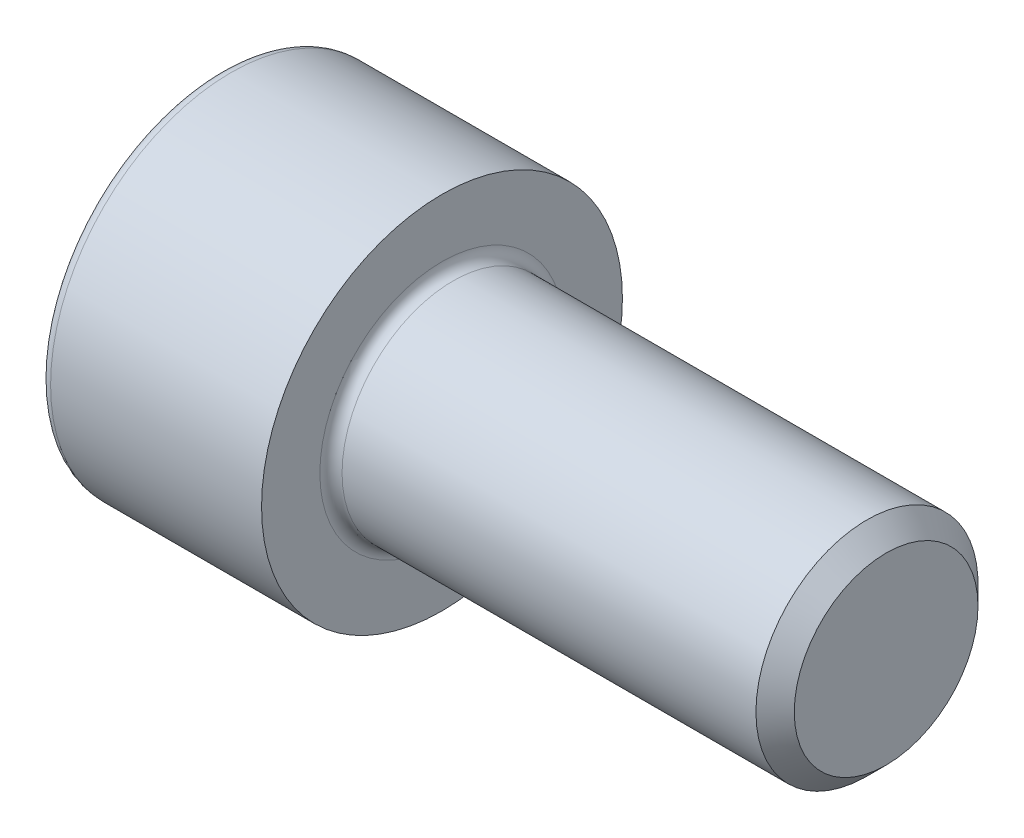
ISO-10303-21;
HEADER;
FILE_DESCRIPTION(('STEP AP214'),'2;1');
FILE_NAME('part.step','',(''),(''),'','','');
FILE_SCHEMA(('AUTOMOTIVE_DESIGN { 1 0 10303 214 1 1 1 1 }'));
ENDSEC;
DATA;
#1=APPLICATION_CONTEXT('core data for automotive mechanical design processes');
#2=APPLICATION_PROTOCOL_DEFINITION('international standard','automotive_design',2000,#1);
#3=PRODUCT_CONTEXT('',#1,'mechanical');
#4=PRODUCT('Part','Part','',(#3));
#5=PRODUCT_RELATED_PRODUCT_CATEGORY('part','',(#4));
#6=PRODUCT_DEFINITION_FORMATION('','',#4);
#7=PRODUCT_DEFINITION_CONTEXT('part definition',#1,'design');
#8=PRODUCT_DEFINITION('design','',#6,#7);
#9=PRODUCT_DEFINITION_SHAPE('','',#8);
#10=(LENGTH_UNIT() NAMED_UNIT(*) SI_UNIT(.MILLI.,.METRE.));
#11=(NAMED_UNIT(*) PLANE_ANGLE_UNIT() SI_UNIT($,.RADIAN.));
#12=(NAMED_UNIT(*) SI_UNIT($,.STERADIAN.) SOLID_ANGLE_UNIT());
#13=UNCERTAINTY_MEASURE_WITH_UNIT(LENGTH_MEASURE(1.E-05),#10,'distance_accuracy_value','');
#14=(GEOMETRIC_REPRESENTATION_CONTEXT(3) GLOBAL_UNCERTAINTY_ASSIGNED_CONTEXT((#13)) GLOBAL_UNIT_ASSIGNED_CONTEXT((#10,
#11,#12)) REPRESENTATION_CONTEXT('',''));
#15=CARTESIAN_POINT('',(0.,0.,0.));
#16=DIRECTION('',(0.,0.,1.));
#17=DIRECTION('',(1.,0.,0.));
#18=AXIS2_PLACEMENT_3D('',#15,#16,#17);
#19=CARTESIAN_POINT('',(0.,0.,0.));
#20=DIRECTION('',(-1.,0.,0.));
#21=DIRECTION('',(0.,0.,1.));
#22=AXIS2_PLACEMENT_3D('',#19,#20,#21);
#23=PLANE('',#22);
#24=DIRECTION('',(0.,-0.5,0.866025403784439));
#25=VECTOR('',#24,1.);
#26=CARTESIAN_POINT('',(0.,3.51894989071077,0.));
#27=LINE('',#26,#25);
#28=CARTESIAN_POINT('',(0.,3.51894989071077,0.));
#29=VERTEX_POINT('',#28);
#30=CARTESIAN_POINT('',(0.,1.75947494535539,3.0475));
#31=VERTEX_POINT('',#30);
#32=EDGE_CURVE('E262',#29,#31,#27,.T.);
#33=ORIENTED_EDGE('',*,*,#32,.T.);
#34=DIRECTION('',(0.,1.,0.));
#35=VECTOR('',#34,1.);
#36=CARTESIAN_POINT('',(0.,-1.75947494535538,3.0475));
#37=LINE('',#36,#35);
#38=CARTESIAN_POINT('',(0.,-1.75947494535538,3.0475));
#39=VERTEX_POINT('',#38);
#40=EDGE_CURVE('E134',#39,#31,#37,.T.);
#41=ORIENTED_EDGE('',*,*,#40,.F.);
#42=DIRECTION('',(0.,-0.500000000000001,-0.866025403784438));
#43=VECTOR('',#42,1.);
#44=CARTESIAN_POINT('',(0.,-1.75947494535538,3.0475));
#45=LINE('',#44,#43);
#46=CARTESIAN_POINT('',(0.,-3.51894989071077,0.));
#47=VERTEX_POINT('',#46);
#48=EDGE_CURVE('E265',#39,#47,#45,.T.);
#49=ORIENTED_EDGE('',*,*,#48,.T.);
#50=DIRECTION('',(0.,0.5,-0.866025403784439));
#51=VECTOR('',#50,1.);
#52=CARTESIAN_POINT('',(0.,-3.51894989071077,0.));
#53=LINE('',#52,#51);
#54=CARTESIAN_POINT('',(0.,-1.75947494535539,-3.0475));
#55=VERTEX_POINT('',#54);
#56=EDGE_CURVE('E268',#47,#55,#53,.T.);
#57=ORIENTED_EDGE('',*,*,#56,.T.);
#58=DIRECTION('',(0.,-1.,0.));
#59=VECTOR('',#58,1.);
#60=CARTESIAN_POINT('',(0.,1.75947494535538,-3.0475));
#61=LINE('',#60,#59);
#62=CARTESIAN_POINT('',(0.,1.75947494535538,-3.0475));
#63=VERTEX_POINT('',#62);
#64=EDGE_CURVE('E271',#63,#55,#61,.T.);
#65=ORIENTED_EDGE('',*,*,#64,.F.);
#66=DIRECTION('',(0.,-0.500000000000001,-0.866025403784438));
#67=VECTOR('',#66,1.);
#68=CARTESIAN_POINT('',(0.,3.51894989071077,0.));
#69=LINE('',#68,#67);
#70=EDGE_CURVE('E129',#29,#63,#69,.T.);
#71=ORIENTED_EDGE('',*,*,#70,.F.);
#72=EDGE_LOOP('',(#33,#41,#49,#57,#65,#71));
#73=FACE_BOUND('',#72,.T.);
#74=CARTESIAN_POINT('',(0.,0.,0.));
#75=DIRECTION('',(-1.,0.,0.));
#76=DIRECTION('',(0.,0.,1.));
#77=AXIS2_PLACEMENT_3D('',#74,#75,#76);
#78=CIRCLE('',#77,6.1);
#79=CARTESIAN_POINT('',(0.,0.,6.1));
#80=VERTEX_POINT('',#79);
#81=EDGE_CURVE('E46',#80,#80,#78,.T.);
#82=ORIENTED_EDGE('',*,*,#81,.T.);
#83=EDGE_LOOP('',(#82));
#84=FACE_BOUND('',#83,.T.);
#85=ADVANCED_FACE('F38',(#73,#84),#23,.T.);
#86=CARTESIAN_POINT('',(-31.75,0.,0.));
#87=DIRECTION('',(-1.,0.,0.));
#88=DIRECTION('',(0.,0.,1.));
#89=AXIS2_PLACEMENT_3D('',#86,#87,#88);
#90=CYLINDRICAL_SURFACE('',#89,6.5);
#91=CARTESIAN_POINT('',(0.399999999999998,0.,0.));
#92=DIRECTION('',(-1.,0.,0.));
#93=DIRECTION('',(0.,0.,1.));
#94=AXIS2_PLACEMENT_3D('',#91,#92,#93);
#95=CIRCLE('',#94,6.5);
#96=CARTESIAN_POINT('',(0.399999999999998,0.,6.5));
#97=VERTEX_POINT('',#96);
#98=EDGE_CURVE('E11',#97,#97,#95,.F.);
#99=ORIENTED_EDGE('',*,*,#98,.T.);
#100=EDGE_LOOP('',(#99));
#101=FACE_BOUND('',#100,.T.);
#102=CARTESIAN_POINT('',(8.,0.,0.));
#103=DIRECTION('',(-1.,0.,0.));
#104=DIRECTION('',(0.,0.,1.));
#105=AXIS2_PLACEMENT_3D('',#102,#103,#104);
#106=CIRCLE('',#105,6.5);
#107=CARTESIAN_POINT('',(8.,0.,6.5));
#108=VERTEX_POINT('',#107);
#109=EDGE_CURVE('E152',#108,#108,#106,.T.);
#110=ORIENTED_EDGE('',*,*,#109,.T.);
#111=EDGE_LOOP('',(#110));
#112=FACE_BOUND('',#111,.T.);
#113=ADVANCED_FACE('F176',(#101,#112),#90,.T.);
#114=CARTESIAN_POINT('',(8.,6.5,0.));
#115=DIRECTION('',(1.,0.,0.));
#116=DIRECTION('',(0.,0.,-1.));
#117=AXIS2_PLACEMENT_3D('',#114,#115,#116);
#118=PLANE('',#117);
#119=CARTESIAN_POINT('',(8.,0.,0.));
#120=DIRECTION('',(1.,0.,0.));
#121=DIRECTION('',(0.,0.,-1.));
#122=AXIS2_PLACEMENT_3D('',#119,#120,#121);
#123=CIRCLE('',#122,4.4);
#124=CARTESIAN_POINT('',(8.,0.,-4.4));
#125=VERTEX_POINT('',#124);
#126=EDGE_CURVE('E155',#125,#125,#123,.F.);
#127=ORIENTED_EDGE('',*,*,#126,.T.);
#128=EDGE_LOOP('',(#127));
#129=FACE_BOUND('',#128,.T.);
#130=ORIENTED_EDGE('',*,*,#109,.F.);
#131=EDGE_LOOP('',(#130));
#132=FACE_BOUND('',#131,.T.);
#133=ADVANCED_FACE('F182',(#129,#132),#118,.T.);
#134=CARTESIAN_POINT('',(-31.75,0.,0.));
#135=DIRECTION('',(-1.,0.,0.));
#136=DIRECTION('',(0.,0.,1.));
#137=AXIS2_PLACEMENT_3D('',#134,#135,#136);
#138=CYLINDRICAL_SURFACE('',#137,4.);
#139=CARTESIAN_POINT('',(8.4,0.,0.));
#140=DIRECTION('',(1.,0.,0.));
#141=DIRECTION('',(0.,0.,-1.));
#142=AXIS2_PLACEMENT_3D('',#139,#140,#141);
#143=CIRCLE('',#142,4.);
#144=CARTESIAN_POINT('',(8.4,0.,-4.));
#145=VERTEX_POINT('',#144);
#146=EDGE_CURVE('E158',#145,#145,#143,.T.);
#147=ORIENTED_EDGE('',*,*,#146,.T.);
#148=EDGE_LOOP('',(#147));
#149=FACE_BOUND('',#148,.T.);
#150=CARTESIAN_POINT('',(23.3095,0.,0.));
#151=DIRECTION('',(-1.,0.,0.));
#152=DIRECTION('',(0.,0.,1.));
#153=AXIS2_PLACEMENT_3D('',#150,#151,#152);
#154=CIRCLE('',#153,4.);
#155=CARTESIAN_POINT('',(23.3095,0.,4.));
#156=VERTEX_POINT('',#155);
#157=EDGE_CURVE('E149',#156,#156,#154,.T.);
#158=ORIENTED_EDGE('',*,*,#157,.T.);
#159=EDGE_LOOP('',(#158));
#160=FACE_BOUND('',#159,.T.);
#161=ADVANCED_FACE('F188',(#149,#160),#138,.T.);
#162=CARTESIAN_POINT('',(24.,0.,0.));
#163=DIRECTION('',(-1.,0.,0.));
#164=DIRECTION('',(0.,0.,1.));
#165=AXIS2_PLACEMENT_3D('',#162,#163,#164);
#166=CONICAL_SURFACE('',#165,3.3095,0.785398163397466);
#167=ORIENTED_EDGE('',*,*,#157,.F.);
#168=EDGE_LOOP('',(#167));
#169=FACE_BOUND('',#168,.T.);
#170=CARTESIAN_POINT('',(24.,0.,0.));
#171=DIRECTION('',(-1.,0.,0.));
#172=DIRECTION('',(0.,0.,1.));
#173=AXIS2_PLACEMENT_3D('',#170,#171,#172);
#174=CIRCLE('',#173,3.3095);
#175=CARTESIAN_POINT('',(24.,0.,3.3095));
#176=VERTEX_POINT('',#175);
#177=EDGE_CURVE('E145',#176,#176,#174,.T.);
#178=ORIENTED_EDGE('',*,*,#177,.T.);
#179=EDGE_LOOP('',(#178));
#180=FACE_BOUND('',#179,.T.);
#181=ADVANCED_FACE('F192',(#169,#180),#166,.T.);
#182=CARTESIAN_POINT('',(24.,3.3095,0.));
#183=DIRECTION('',(1.,0.,0.));
#184=DIRECTION('',(0.,0.,-1.));
#185=AXIS2_PLACEMENT_3D('',#182,#183,#184);
#186=PLANE('',#185);
#187=ORIENTED_EDGE('',*,*,#177,.F.);
#188=EDGE_LOOP('',(#187));
#189=FACE_BOUND('',#188,.T.);
#190=ADVANCED_FACE('F172',(#189),#186,.T.);
#191=CARTESIAN_POINT('',(8.4,0.,0.));
#192=DIRECTION('',(1.,0.,0.));
#193=DIRECTION('',(0.,0.,-1.));
#194=AXIS2_PLACEMENT_3D('',#191,#192,#193);
#195=TOROIDAL_SURFACE('',#194,4.4,0.4);
#196=ORIENTED_EDGE('',*,*,#146,.F.);
#197=EDGE_LOOP('',(#196));
#198=FACE_BOUND('',#197,.T.);
#199=ORIENTED_EDGE('',*,*,#126,.F.);
#200=EDGE_LOOP('',(#199));
#201=FACE_BOUND('',#200,.T.);
#202=ADVANCED_FACE('F165',(#198,#201),#195,.F.);
#203=CARTESIAN_POINT('',(0.399999999999998,0.,0.));
#204=DIRECTION('',(-1.,0.,0.));
#205=DIRECTION('',(0.,0.,1.));
#206=AXIS2_PLACEMENT_3D('',#203,#204,#205);
#207=TOROIDAL_SURFACE('',#206,6.1,0.4);
#208=ORIENTED_EDGE('',*,*,#98,.F.);
#209=EDGE_LOOP('',(#208));
#210=FACE_BOUND('',#209,.T.);
#211=ORIENTED_EDGE('',*,*,#81,.F.);
#212=EDGE_LOOP('',(#211));
#213=FACE_BOUND('',#212,.T.);
#214=ADVANCED_FACE('F40',(#210,#213),#207,.T.);
#215=CARTESIAN_POINT('',(4.,3.51894989071077,0.));
#216=DIRECTION('',(0.,-0.866025403784439,-0.5));
#217=DIRECTION('',(0.,0.5,-0.866025403784439));
#218=AXIS2_PLACEMENT_3D('',#215,#216,#217);
#219=PLANE('',#218);
#220=ORIENTED_EDGE('',*,*,#32,.F.);
#221=DIRECTION('',(-1.,0.,0.));
#222=VECTOR('',#221,1.);
#223=CARTESIAN_POINT('',(4.,3.51894989071077,0.));
#224=LINE('',#223,#222);
#225=CARTESIAN_POINT('',(4.,3.51894989071077,0.));
#226=VERTEX_POINT('',#225);
#227=EDGE_CURVE('E252',#226,#29,#224,.T.);
#228=ORIENTED_EDGE('',*,*,#227,.F.);
#229=DIRECTION('',(0.,-0.5,0.866025403784439));
#230=VECTOR('',#229,1.);
#231=CARTESIAN_POINT('',(4.,3.51894989071077,0.));
#232=LINE('',#231,#230);
#233=CARTESIAN_POINT('',(4.,2.63921241803308,1.52375));
#234=VERTEX_POINT('',#233);
#235=EDGE_CURVE('E121',#226,#234,#232,.T.);
#236=ORIENTED_EDGE('',*,*,#235,.T.);
#237=CARTESIAN_POINT('',(4.,1.75947494535539,3.0475));
#238=VERTEX_POINT('',#237);
#239=EDGE_CURVE('E112',#234,#238,#232,.T.);
#240=ORIENTED_EDGE('',*,*,#239,.T.);
#241=DIRECTION('',(-1.,0.,0.));
#242=VECTOR('',#241,1.);
#243=CARTESIAN_POINT('',(4.,1.75947494535539,3.0475));
#244=LINE('',#243,#242);
#245=EDGE_CURVE('E126',#238,#31,#244,.T.);
#246=ORIENTED_EDGE('',*,*,#245,.T.);
#247=EDGE_LOOP('',(#220,#228,#236,#240,#246));
#248=FACE_BOUND('',#247,.T.);
#249=ADVANCED_FACE('F125',(#248),#219,.T.);
#250=CARTESIAN_POINT('',(4.,-1.75947494535538,3.0475));
#251=DIRECTION('',(0.,0.,1.));
#252=DIRECTION('',(0.,-1.,0.));
#253=AXIS2_PLACEMENT_3D('',#250,#251,#252);
#254=PLANE('',#253);
#255=ORIENTED_EDGE('',*,*,#40,.T.);
#256=ORIENTED_EDGE('',*,*,#245,.F.);
#257=DIRECTION('',(0.,1.,0.));
#258=VECTOR('',#257,1.);
#259=CARTESIAN_POINT('',(4.,-1.75947494535538,3.0475));
#260=LINE('',#259,#258);
#261=CARTESIAN_POINT('',(4.,0.,3.0475));
#262=VERTEX_POINT('',#261);
#263=EDGE_CURVE('E109',#262,#238,#260,.T.);
#264=ORIENTED_EDGE('',*,*,#263,.F.);
#265=CARTESIAN_POINT('',(4.,-1.75947494535538,3.0475));
#266=VERTEX_POINT('',#265);
#267=EDGE_CURVE('E120',#266,#262,#260,.T.);
#268=ORIENTED_EDGE('',*,*,#267,.F.);
#269=DIRECTION('',(-1.,0.,0.));
#270=VECTOR('',#269,1.);
#271=CARTESIAN_POINT('',(4.,-1.75947494535538,3.0475));
#272=LINE('',#271,#270);
#273=EDGE_CURVE('E136',#266,#39,#272,.T.);
#274=ORIENTED_EDGE('',*,*,#273,.T.);
#275=EDGE_LOOP('',(#255,#256,#264,#268,#274));
#276=FACE_BOUND('',#275,.T.);
#277=ADVANCED_FACE('F131',(#276),#254,.F.);
#278=CARTESIAN_POINT('',(4.,-1.75947494535538,3.0475));
#279=DIRECTION('',(0.,0.866025403784438,-0.500000000000001));
#280=DIRECTION('',(0.,0.500000000000001,0.866025403784438));
#281=AXIS2_PLACEMENT_3D('',#278,#279,#280);
#282=PLANE('',#281);
#283=ORIENTED_EDGE('',*,*,#48,.F.);
#284=ORIENTED_EDGE('',*,*,#273,.F.);
#285=DIRECTION('',(0.,-0.500000000000001,-0.866025403784438));
#286=VECTOR('',#285,1.);
#287=CARTESIAN_POINT('',(4.,-1.75947494535538,3.0475));
#288=LINE('',#287,#286);
#289=CARTESIAN_POINT('',(4.,-2.63921241803308,1.52375));
#290=VERTEX_POINT('',#289);
#291=EDGE_CURVE('E291',#266,#290,#288,.T.);
#292=ORIENTED_EDGE('',*,*,#291,.T.);
#293=CARTESIAN_POINT('',(4.,-3.51894989071077,0.));
#294=VERTEX_POINT('',#293);
#295=EDGE_CURVE('E280',#290,#294,#288,.T.);
#296=ORIENTED_EDGE('',*,*,#295,.T.);
#297=DIRECTION('',(-1.,0.,0.));
#298=VECTOR('',#297,1.);
#299=CARTESIAN_POINT('',(4.,-3.51894989071077,0.));
#300=LINE('',#299,#298);
#301=EDGE_CURVE('E141',#294,#47,#300,.T.);
#302=ORIENTED_EDGE('',*,*,#301,.T.);
#303=EDGE_LOOP('',(#283,#284,#292,#296,#302));
#304=FACE_BOUND('',#303,.T.);
#305=ADVANCED_FACE('F206',(#304),#282,.T.);
#306=CARTESIAN_POINT('',(4.,-3.51894989071077,0.));
#307=DIRECTION('',(0.,0.866025403784439,0.5));
#308=DIRECTION('',(0.,-0.5,0.866025403784439));
#309=AXIS2_PLACEMENT_3D('',#306,#307,#308);
#310=PLANE('',#309);
#311=ORIENTED_EDGE('',*,*,#56,.F.);
#312=ORIENTED_EDGE('',*,*,#301,.F.);
#313=DIRECTION('',(0.,0.5,-0.866025403784439));
#314=VECTOR('',#313,1.);
#315=CARTESIAN_POINT('',(4.,-3.51894989071077,0.));
#316=LINE('',#315,#314);
#317=CARTESIAN_POINT('',(4.,-2.63921241803308,-1.52375));
#318=VERTEX_POINT('',#317);
#319=EDGE_CURVE('E258',#294,#318,#316,.T.);
#320=ORIENTED_EDGE('',*,*,#319,.T.);
#321=CARTESIAN_POINT('',(4.,-1.75947494535539,-3.0475));
#322=VERTEX_POINT('',#321);
#323=EDGE_CURVE('E290',#318,#322,#316,.T.);
#324=ORIENTED_EDGE('',*,*,#323,.T.);
#325=DIRECTION('',(-1.,0.,0.));
#326=VECTOR('',#325,1.);
#327=CARTESIAN_POINT('',(4.,-1.75947494535539,-3.0475));
#328=LINE('',#327,#326);
#329=EDGE_CURVE('E251',#322,#55,#328,.T.);
#330=ORIENTED_EDGE('',*,*,#329,.T.);
#331=EDGE_LOOP('',(#311,#312,#320,#324,#330));
#332=FACE_BOUND('',#331,.T.);
#333=ADVANCED_FACE('F209',(#332),#310,.T.);
#334=CARTESIAN_POINT('',(4.,1.75947494535538,-3.0475));
#335=DIRECTION('',(0.,0.,-1.));
#336=DIRECTION('',(0.,1.,0.));
#337=AXIS2_PLACEMENT_3D('',#334,#335,#336);
#338=PLANE('',#337);
#339=ORIENTED_EDGE('',*,*,#64,.T.);
#340=ORIENTED_EDGE('',*,*,#329,.F.);
#341=DIRECTION('',(0.,-1.,0.));
#342=VECTOR('',#341,1.);
#343=CARTESIAN_POINT('',(4.,1.75947494535538,-3.0475));
#344=LINE('',#343,#342);
#345=CARTESIAN_POINT('',(4.,0.,-3.0475));
#346=VERTEX_POINT('',#345);
#347=EDGE_CURVE('E255',#346,#322,#344,.T.);
#348=ORIENTED_EDGE('',*,*,#347,.F.);
#349=CARTESIAN_POINT('',(4.,1.75947494535538,-3.0475));
#350=VERTEX_POINT('',#349);
#351=EDGE_CURVE('E53',#350,#346,#344,.T.);
#352=ORIENTED_EDGE('',*,*,#351,.F.);
#353=DIRECTION('',(-1.,0.,0.));
#354=VECTOR('',#353,1.);
#355=CARTESIAN_POINT('',(4.,1.75947494535538,-3.0475));
#356=LINE('',#355,#354);
#357=EDGE_CURVE('E248',#350,#63,#356,.T.);
#358=ORIENTED_EDGE('',*,*,#357,.T.);
#359=EDGE_LOOP('',(#339,#340,#348,#352,#358));
#360=FACE_BOUND('',#359,.T.);
#361=ADVANCED_FACE('F213',(#360),#338,.F.);
#362=CARTESIAN_POINT('',(4.,3.51894989071077,0.));
#363=DIRECTION('',(0.,0.866025403784438,-0.500000000000001));
#364=DIRECTION('',(0.,0.500000000000001,0.866025403784438));
#365=AXIS2_PLACEMENT_3D('',#362,#363,#364);
#366=PLANE('',#365);
#367=ORIENTED_EDGE('',*,*,#70,.T.);
#368=ORIENTED_EDGE('',*,*,#357,.F.);
#369=DIRECTION('',(0.,-0.500000000000001,-0.866025403784438));
#370=VECTOR('',#369,1.);
#371=CARTESIAN_POINT('',(4.,3.51894989071077,0.));
#372=LINE('',#371,#370);
#373=CARTESIAN_POINT('',(4.,2.63921241803307,-1.52375));
#374=VERTEX_POINT('',#373);
#375=EDGE_CURVE('E238',#374,#350,#372,.T.);
#376=ORIENTED_EDGE('',*,*,#375,.F.);
#377=EDGE_CURVE('E244',#226,#374,#372,.T.);
#378=ORIENTED_EDGE('',*,*,#377,.F.);
#379=ORIENTED_EDGE('',*,*,#227,.T.);
#380=EDGE_LOOP('',(#367,#368,#376,#378,#379));
#381=FACE_BOUND('',#380,.T.);
#382=ADVANCED_FACE('F217',(#381),#366,.F.);
#383=CARTESIAN_POINT('',(4.,3.51894989071077,0.));
#384=DIRECTION('',(1.,0.,0.));
#385=DIRECTION('',(0.,0.,-1.));
#386=AXIS2_PLACEMENT_3D('',#383,#384,#385);
#387=PLANE('',#386);
#388=ORIENTED_EDGE('',*,*,#347,.T.);
#389=ORIENTED_EDGE('',*,*,#323,.F.);
#390=CARTESIAN_POINT('',(4.,0.,0.));
#391=DIRECTION('',(-1.,0.,0.));
#392=DIRECTION('',(0.,0.,1.));
#393=AXIS2_PLACEMENT_3D('',#390,#391,#392);
#394=CIRCLE('',#393,3.0475);
#395=EDGE_CURVE('E286',#346,#318,#394,.T.);
#396=ORIENTED_EDGE('',*,*,#395,.F.);
#397=EDGE_LOOP('',(#388,#389,#396));
#398=FACE_BOUND('',#397,.T.);
#399=ADVANCED_FACE('F221',(#398),#387,.F.);
#400=ORIENTED_EDGE('',*,*,#319,.F.);
#401=ORIENTED_EDGE('',*,*,#295,.F.);
#402=EDGE_CURVE('E139',#318,#290,#394,.T.);
#403=ORIENTED_EDGE('',*,*,#402,.F.);
#404=EDGE_LOOP('',(#400,#401,#403));
#405=FACE_BOUND('',#404,.T.);
#406=ADVANCED_FACE('F224',(#405),#387,.F.);
#407=ORIENTED_EDGE('',*,*,#291,.F.);
#408=ORIENTED_EDGE('',*,*,#267,.T.);
#409=EDGE_CURVE('E135',#290,#262,#394,.T.);
#410=ORIENTED_EDGE('',*,*,#409,.F.);
#411=EDGE_LOOP('',(#407,#408,#410));
#412=FACE_BOUND('',#411,.T.);
#413=ADVANCED_FACE('F229',(#412),#387,.F.);
#414=ORIENTED_EDGE('',*,*,#263,.T.);
#415=ORIENTED_EDGE('',*,*,#239,.F.);
#416=EDGE_CURVE('E115',#262,#234,#394,.T.);
#417=ORIENTED_EDGE('',*,*,#416,.F.);
#418=EDGE_LOOP('',(#414,#415,#417));
#419=FACE_BOUND('',#418,.T.);
#420=ADVANCED_FACE('F111',(#419),#387,.F.);
#421=ORIENTED_EDGE('',*,*,#235,.F.);
#422=ORIENTED_EDGE('',*,*,#377,.T.);
#423=EDGE_CURVE('E146',#234,#374,#394,.T.);
#424=ORIENTED_EDGE('',*,*,#423,.F.);
#425=EDGE_LOOP('',(#421,#422,#424));
#426=FACE_BOUND('',#425,.T.);
#427=ADVANCED_FACE('F232',(#426),#387,.F.);
#428=ORIENTED_EDGE('',*,*,#375,.T.);
#429=ORIENTED_EDGE('',*,*,#351,.T.);
#430=EDGE_CURVE('E241',#374,#346,#394,.T.);
#431=ORIENTED_EDGE('',*,*,#430,.F.);
#432=EDGE_LOOP('',(#428,#429,#431));
#433=FACE_BOUND('',#432,.T.);
#434=ADVANCED_FACE('F202',(#433),#387,.F.);
#435=CARTESIAN_POINT('',(4.,0.,0.));
#436=DIRECTION('',(-1.,0.,0.));
#437=DIRECTION('',(0.,0.,1.));
#438=AXIS2_PLACEMENT_3D('',#435,#436,#437);
#439=CONICAL_SURFACE('',#438,3.0475,1.04719755119659);
#440=CARTESIAN_POINT('',(5.75947494535541,0.,0.));
#441=VERTEX_POINT('',#440);
#442=VERTEX_LOOP('',#441);
#443=FACE_BOUND('',#442,.T.);
#444=ORIENTED_EDGE('',*,*,#416,.T.);
#445=ORIENTED_EDGE('',*,*,#423,.T.);
#446=ORIENTED_EDGE('',*,*,#430,.T.);
#447=ORIENTED_EDGE('',*,*,#395,.T.);
#448=ORIENTED_EDGE('',*,*,#402,.T.);
#449=ORIENTED_EDGE('',*,*,#409,.T.);
#450=EDGE_LOOP('',(#444,#445,#446,#447,#448,#449));
#451=FACE_BOUND('',#450,.T.);
#452=ADVANCED_FACE('F200',(#443,#451),#439,.F.);
#453=CLOSED_SHELL('',(#85,#113,#133,#161,#181,#190,#202,#214,#249,#277,#305,#333,#361,#382,#399,
#406,#413,#420,#427,#434,#452));
#454=MANIFOLD_SOLID_BREP('B2',#453);
#455=ADVANCED_BREP_SHAPE_REPRESENTATION('',(#18,#454),#14);
#456=SHAPE_DEFINITION_REPRESENTATION(#9,#455);
ENDSEC;
END-ISO-10303-21;
